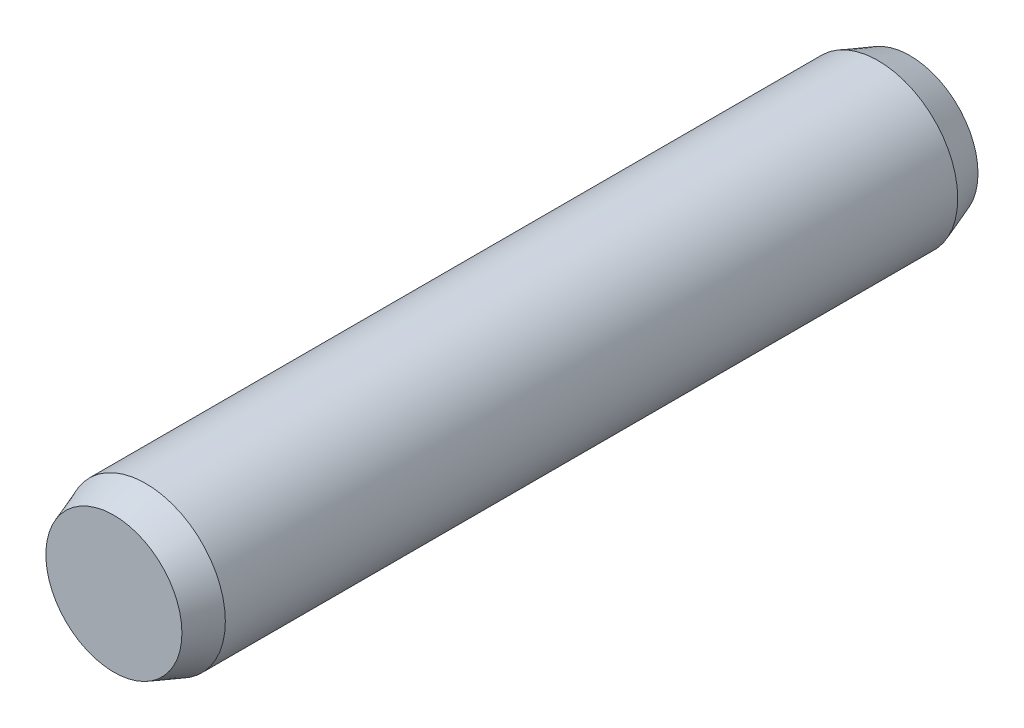
ISO-10303-21;
HEADER;
FILE_DESCRIPTION(('STEP AP214'),'2;1');
FILE_NAME('part.step','',(''),(''),'','','');
FILE_SCHEMA(('AUTOMOTIVE_DESIGN { 1 0 10303 214 1 1 1 1 }'));
ENDSEC;
DATA;
#1=APPLICATION_CONTEXT('core data for automotive mechanical design processes');
#2=APPLICATION_PROTOCOL_DEFINITION('international standard','automotive_design',2000,#1);
#3=PRODUCT_CONTEXT('',#1,'mechanical');
#4=PRODUCT('Part','Part','',(#3));
#5=PRODUCT_RELATED_PRODUCT_CATEGORY('part','',(#4));
#6=PRODUCT_DEFINITION_FORMATION('','',#4);
#7=PRODUCT_DEFINITION_CONTEXT('part definition',#1,'design');
#8=PRODUCT_DEFINITION('design','',#6,#7);
#9=PRODUCT_DEFINITION_SHAPE('','',#8);
#10=(LENGTH_UNIT() NAMED_UNIT(*) SI_UNIT(.MILLI.,.METRE.));
#11=(NAMED_UNIT(*) PLANE_ANGLE_UNIT() SI_UNIT($,.RADIAN.));
#12=(NAMED_UNIT(*) SI_UNIT($,.STERADIAN.) SOLID_ANGLE_UNIT());
#13=UNCERTAINTY_MEASURE_WITH_UNIT(LENGTH_MEASURE(1.E-05),#10,'distance_accuracy_value','');
#14=(GEOMETRIC_REPRESENTATION_CONTEXT(3) GLOBAL_UNCERTAINTY_ASSIGNED_CONTEXT((#13)) GLOBAL_UNIT_ASSIGNED_CONTEXT((#10,
#11,#12)) REPRESENTATION_CONTEXT('',''));
#15=CARTESIAN_POINT('',(0.,0.,0.));
#16=DIRECTION('',(0.,0.,1.));
#17=DIRECTION('',(1.,0.,0.));
#18=AXIS2_PLACEMENT_3D('',#15,#16,#17);
#19=CARTESIAN_POINT('',(0.,0.,-2.));
#20=DIRECTION('',(0.,0.,1.));
#21=DIRECTION('',(1.,0.,0.));
#22=AXIS2_PLACEMENT_3D('',#19,#20,#21);
#23=CYLINDRICAL_SURFACE('',#22,0.399999999999999);
#24=CARTESIAN_POINT('',(0.,0.,1.84));
#25=DIRECTION('',(0.,0.,1.));
#26=DIRECTION('',(1.,0.,0.));
#27=AXIS2_PLACEMENT_3D('',#24,#25,#26);
#28=CIRCLE('',#27,0.399999999999999);
#29=CARTESIAN_POINT('',(0.399999999999999,0.,1.84));
#30=VERTEX_POINT('',#29);
#31=EDGE_CURVE('E44',#30,#30,#28,.F.);
#32=ORIENTED_EDGE('',*,*,#31,.T.);
#33=EDGE_LOOP('',(#32));
#34=FACE_BOUND('',#33,.T.);
#35=CARTESIAN_POINT('',(0.,0.,-1.83999999999999));
#36=DIRECTION('',(0.,0.,1.));
#37=DIRECTION('',(1.,0.,0.));
#38=AXIS2_PLACEMENT_3D('',#35,#36,#37);
#39=CIRCLE('',#38,0.399999999999999);
#40=CARTESIAN_POINT('',(0.399999999999999,0.,-1.83999999999999));
#41=VERTEX_POINT('',#40);
#42=EDGE_CURVE('E48',#41,#41,#39,.T.);
#43=ORIENTED_EDGE('',*,*,#42,.T.);
#44=EDGE_LOOP('',(#43));
#45=FACE_BOUND('',#44,.T.);
#46=ADVANCED_FACE('F37',(#34,#45),#23,.T.);
#47=CARTESIAN_POINT('',(0.,0.,-2.));
#48=DIRECTION('',(0.,0.,1.));
#49=DIRECTION('',(1.,0.,0.));
#50=AXIS2_PLACEMENT_3D('',#47,#48,#49);
#51=PLANE('',#50);
#52=CARTESIAN_POINT('',(0.,0.,-2.));
#53=DIRECTION('',(0.,0.,1.));
#54=DIRECTION('',(1.,0.,0.));
#55=AXIS2_PLACEMENT_3D('',#52,#53,#54);
#56=CIRCLE('',#55,0.341764762517406);
#57=CARTESIAN_POINT('',(0.341764762517406,0.,-2.));
#58=VERTEX_POINT('',#57);
#59=EDGE_CURVE('E10',#58,#58,#56,.F.);
#60=ORIENTED_EDGE('',*,*,#59,.T.);
#61=EDGE_LOOP('',(#60));
#62=FACE_BOUND('',#61,.T.);
#63=ADVANCED_FACE('F68',(#62),#51,.F.);
#64=CARTESIAN_POINT('',(0.,0.,2.));
#65=DIRECTION('',(0.,0.,1.));
#66=DIRECTION('',(1.,0.,0.));
#67=AXIS2_PLACEMENT_3D('',#64,#65,#66);
#68=PLANE('',#67);
#69=CARTESIAN_POINT('',(0.,0.,2.));
#70=DIRECTION('',(0.,0.,1.));
#71=DIRECTION('',(1.,0.,0.));
#72=AXIS2_PLACEMENT_3D('',#69,#70,#71);
#73=CIRCLE('',#72,0.341764762517407);
#74=CARTESIAN_POINT('',(0.341764762517407,0.,2.));
#75=VERTEX_POINT('',#74);
#76=EDGE_CURVE('E52',#75,#75,#73,.T.);
#77=ORIENTED_EDGE('',*,*,#76,.T.);
#78=EDGE_LOOP('',(#77));
#79=FACE_BOUND('',#78,.T.);
#80=ADVANCED_FACE('F58',(#79),#68,.T.);
#81=CARTESIAN_POINT('',(0.,0.,2.));
#82=DIRECTION('',(0.,0.,-1.));
#83=DIRECTION('',(-1.,0.,0.));
#84=AXIS2_PLACEMENT_3D('',#81,#82,#83);
#85=CONICAL_SURFACE('',#84,0.341764762517407,0.349065850398863);
#86=ORIENTED_EDGE('',*,*,#31,.F.);
#87=EDGE_LOOP('',(#86));
#88=FACE_BOUND('',#87,.T.);
#89=ORIENTED_EDGE('',*,*,#76,.F.);
#90=EDGE_LOOP('',(#89));
#91=FACE_BOUND('',#90,.T.);
#92=ADVANCED_FACE('F60',(#88,#91),#85,.T.);
#93=CARTESIAN_POINT('',(0.,0.,-1.83999999999999));
#94=DIRECTION('',(0.,0.,1.));
#95=DIRECTION('',(1.,0.,0.));
#96=AXIS2_PLACEMENT_3D('',#93,#94,#95);
#97=CONICAL_SURFACE('',#96,0.399999999999999,0.349065850398862);
#98=ORIENTED_EDGE('',*,*,#59,.F.);
#99=EDGE_LOOP('',(#98));
#100=FACE_BOUND('',#99,.T.);
#101=ORIENTED_EDGE('',*,*,#42,.F.);
#102=EDGE_LOOP('',(#101));
#103=FACE_BOUND('',#102,.T.);
#104=ADVANCED_FACE('F39',(#100,#103),#97,.T.);
#105=CLOSED_SHELL('',(#46,#63,#80,#92,#104));
#106=MANIFOLD_SOLID_BREP('B2',#105);
#107=ADVANCED_BREP_SHAPE_REPRESENTATION('',(#18,#106),#14);
#108=SHAPE_DEFINITION_REPRESENTATION(#9,#107);
ENDSEC;
END-ISO-10303-21;
